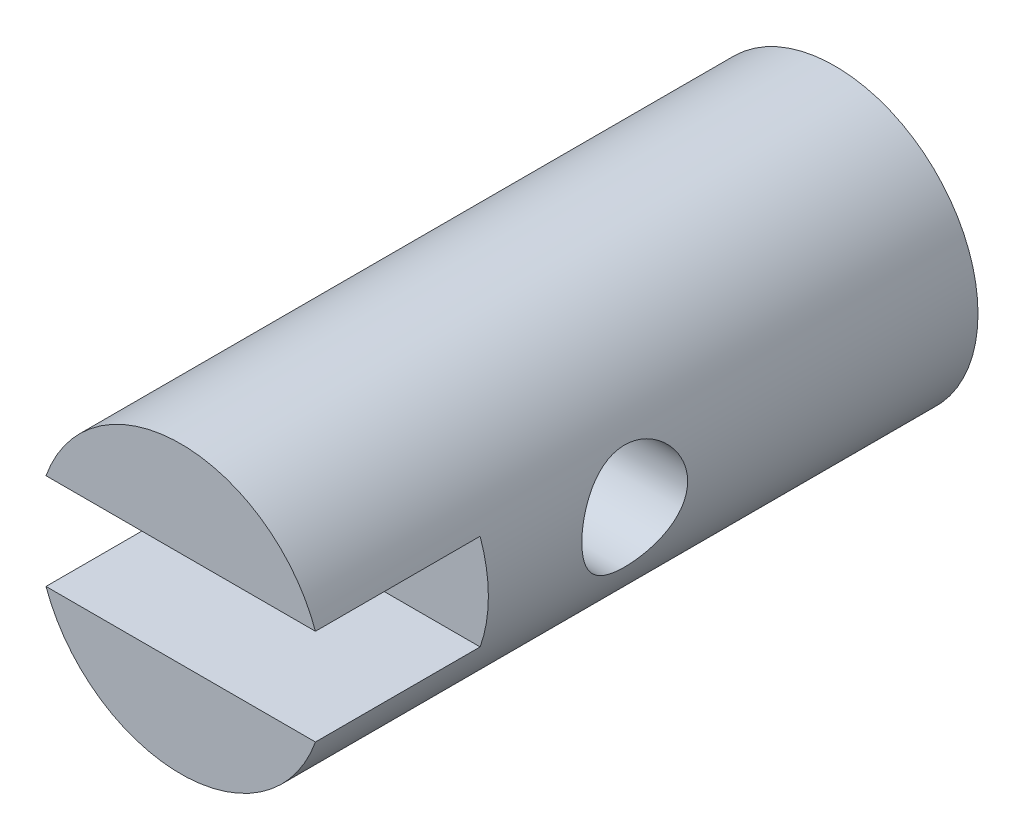
ISO-10303-21;
HEADER;
FILE_DESCRIPTION(('STEP AP214'),'2;1');
FILE_NAME('part.step','',(''),(''),'','','');
FILE_SCHEMA(('AUTOMOTIVE_DESIGN { 1 0 10303 214 1 1 1 1 }'));
ENDSEC;
DATA;
#1=APPLICATION_CONTEXT('core data for automotive mechanical design processes');
#2=APPLICATION_PROTOCOL_DEFINITION('international standard','automotive_design',2000,#1);
#3=PRODUCT_CONTEXT('',#1,'mechanical');
#4=PRODUCT('Part','Part','',(#3));
#5=PRODUCT_RELATED_PRODUCT_CATEGORY('part','',(#4));
#6=PRODUCT_DEFINITION_FORMATION('','',#4);
#7=PRODUCT_DEFINITION_CONTEXT('part definition',#1,'design');
#8=PRODUCT_DEFINITION('design','',#6,#7);
#9=PRODUCT_DEFINITION_SHAPE('','',#8);
#10=(LENGTH_UNIT() NAMED_UNIT(*) SI_UNIT(.MILLI.,.METRE.));
#11=(NAMED_UNIT(*) PLANE_ANGLE_UNIT() SI_UNIT($,.RADIAN.));
#12=(NAMED_UNIT(*) SI_UNIT($,.STERADIAN.) SOLID_ANGLE_UNIT());
#13=UNCERTAINTY_MEASURE_WITH_UNIT(LENGTH_MEASURE(1.E-05),#10,'distance_accuracy_value','');
#14=(GEOMETRIC_REPRESENTATION_CONTEXT(3) GLOBAL_UNCERTAINTY_ASSIGNED_CONTEXT((#13)) GLOBAL_UNIT_ASSIGNED_CONTEXT((#10,
#11,#12)) REPRESENTATION_CONTEXT('',''));
#15=CARTESIAN_POINT('',(0.,0.,0.));
#16=DIRECTION('',(0.,0.,1.));
#17=DIRECTION('',(1.,0.,0.));
#18=AXIS2_PLACEMENT_3D('',#15,#16,#17);
#19=CARTESIAN_POINT('',(0.,0.,41.783));
#20=DIRECTION('',(0.,0.,1.));
#21=DIRECTION('',(1.,0.,0.));
#22=AXIS2_PLACEMENT_3D('',#19,#20,#21);
#23=PLANE('',#22);
#24=DIRECTION('',(-1.,0.,0.));
#25=VECTOR('',#24,1.);
#26=CARTESIAN_POINT('',(0.,3.0607,41.783));
#27=LINE('',#26,#25);
#28=CARTESIAN_POINT('',(8.60306661603873,3.0607,41.783));
#29=VERTEX_POINT('',#28);
#30=CARTESIAN_POINT('',(-8.60306661603873,3.0607,41.783));
#31=VERTEX_POINT('',#30);
#32=EDGE_CURVE('E141',#29,#31,#27,.T.);
#33=ORIENTED_EDGE('',*,*,#32,.F.);
#34=CARTESIAN_POINT('',(0.,0.,41.783));
#35=DIRECTION('',(0.,0.,1.));
#36=DIRECTION('',(1.,0.,0.));
#37=AXIS2_PLACEMENT_3D('',#34,#35,#36);
#38=CIRCLE('',#37,9.1313);
#39=EDGE_CURVE('E101',#29,#31,#38,.T.);
#40=ORIENTED_EDGE('',*,*,#39,.T.);
#41=EDGE_LOOP('',(#33,#40));
#42=FACE_BOUND('',#41,.T.);
#43=ADVANCED_FACE('F37',(#42),#23,.T.);
#44=CARTESIAN_POINT('',(0.,0.,41.783));
#45=DIRECTION('',(0.,0.,-1.));
#46=DIRECTION('',(-1.,0.,0.));
#47=AXIS2_PLACEMENT_3D('',#44,#45,#46);
#48=CYLINDRICAL_SURFACE('',#47,9.1313);
#49=CARTESIAN_POINT('',(-9.1313,0.,18.542));
#50=CARTESIAN_POINT('',(-9.13130424236576,0.18312558663475,18.5419942797425));
#51=CARTESIAN_POINT('',(-9.12574289228378,0.366211481619289,18.5569371379998));
#52=CARTESIAN_POINT('',(-9.10411228095916,0.726921230363973,18.6160794294865));
#53=CARTESIAN_POINT('',(-9.08804422098185,0.904545706114898,18.660275518109));
#54=CARTESIAN_POINT('',(-9.04712765580481,1.24907907890347,18.7761537380394));
#55=CARTESIAN_POINT('',(-9.02229581538571,1.41600760791391,18.8477837242498));
#56=CARTESIAN_POINT('',(-8.96633258913036,1.73546933260688,19.0162349237924));
#57=CARTESIAN_POINT('',(-8.93519956303128,1.88799876486627,19.1130626982449));
#58=CARTESIAN_POINT('',(-8.86841189125605,2.18066313409265,19.3333613414608));
#59=CARTESIAN_POINT('',(-8.83263165490555,2.32012084201554,19.457693486222));
#60=CARTESIAN_POINT('',(-8.76120914955084,2.57674800751189,19.727642986959));
#61=CARTESIAN_POINT('',(-8.72556692416797,2.69391090503595,19.8732665855357));
#62=CARTESIAN_POINT('',(-8.65700502397469,2.9068720613982,20.1882159476218));
#63=CARTESIAN_POINT('',(-8.62423416920776,3.00172340425047,20.3582176198172));
#64=CARTESIAN_POINT('',(-8.56707402338661,3.16118835797449,20.7131645761069));
#65=CARTESIAN_POINT('',(-8.54268148727349,3.22581367939103,20.8981040401934));
#66=CARTESIAN_POINT('',(-8.50637996489903,3.32033514427632,21.2698908698107));
#67=CARTESIAN_POINT('',(-8.49400923438129,3.35152106870543,21.4563637436525));
#68=CARTESIAN_POINT('',(-8.48179880574804,3.38231143014571,21.8322746573615));
#69=CARTESIAN_POINT('',(-8.48195410833446,3.38192846669752,22.0217114840961));
#70=CARTESIAN_POINT('',(-8.49437923598532,3.35058006377392,22.3864787565674));
#71=CARTESIAN_POINT('',(-8.50594590324745,3.32138967867976,22.561990111417));
#72=CARTESIAN_POINT('',(-8.53872418929337,3.23618458243237,22.9054196528171));
#73=CARTESIAN_POINT('',(-8.55993722115195,3.18016594120275,23.0733367229338));
#74=CARTESIAN_POINT('',(-8.61005096735515,3.04189681854693,23.4004806662734));
#75=CARTESIAN_POINT('',(-8.63908731588773,2.95917786757003,23.5594878478826));
#76=CARTESIAN_POINT('',(-8.70152940729719,2.77018251617408,23.8618855628594));
#77=CARTESIAN_POINT('',(-8.7349366284049,2.66389813743245,24.0052707826699));
#78=CARTESIAN_POINT('',(-8.80501714659955,2.42261729957539,24.282199616423));
#79=CARTESIAN_POINT('',(-8.84176129639271,2.28619954490603,24.4144899307269));
#80=CARTESIAN_POINT('',(-8.91249680825451,1.99268791637571,24.6546826838072));
#81=CARTESIAN_POINT('',(-8.94648776908502,1.835591037553,24.7625815719692));
#82=CARTESIAN_POINT('',(-9.00853099545885,1.50205256414142,24.9522616677038));
#83=CARTESIAN_POINT('',(-9.03648867812123,1.32536067888519,25.0336358872206));
#84=CARTESIAN_POINT('',(-9.08261587112278,0.95950456109184,25.1650918669263));
#85=CARTESIAN_POINT('',(-9.10078960747312,0.770345753124363,25.2151871390273));
#86=CARTESIAN_POINT('',(-9.12456375240749,0.395481222478244,25.2802778867122));
#87=CARTESIAN_POINT('',(-9.13076835443531,0.210106699788359,25.2969617572526));
#88=CARTESIAN_POINT('',(-9.13176528718625,-0.160875008558489,25.2996588732448));
#89=CARTESIAN_POINT('',(-9.12656006825316,-0.346482135706311,25.2856787040265));
#90=CARTESIAN_POINT('',(-9.10572110272806,-0.705432758511584,25.2287352060644));
#91=CARTESIAN_POINT('',(-9.09048238271331,-0.878975627510878,25.1868690700582));
#92=CARTESIAN_POINT('',(-9.05150520099281,-1.21645876235535,25.0767774362907));
#93=CARTESIAN_POINT('',(-9.02776563330302,-1.38039777548117,25.008548508565));
#94=CARTESIAN_POINT('',(-8.97328125122921,-1.69935749278386,24.8455088824674));
#95=CARTESIAN_POINT('',(-8.94235282305693,-1.85398029521322,24.7499829782563));
#96=CARTESIAN_POINT('',(-8.87692353417264,-2.14551328424185,24.5358731169672));
#97=CARTESIAN_POINT('',(-8.84242138215846,-2.28241702789415,24.4172808115694));
#98=CARTESIAN_POINT('',(-8.77123335838577,-2.54270286392124,24.1525231455044));
#99=CARTESIAN_POINT('',(-8.73453414075953,-2.66488573201806,24.0051793543205));
#100=CARTESIAN_POINT('',(-8.66498683791872,-2.88301733849523,23.6913472618306));
#101=CARTESIAN_POINT('',(-8.63213905022621,-2.97896405090036,23.5248574834666));
#102=CARTESIAN_POINT('',(-8.57418031791271,-3.14191275796083,23.1762781382869));
#103=CARTESIAN_POINT('',(-8.54909452798161,-3.20882092225717,22.9941402464957));
#104=CARTESIAN_POINT('',(-8.51020717438485,-3.31059501147468,22.6200006874294));
#105=CARTESIAN_POINT('',(-8.49639888319723,-3.34548004114043,22.4280049735465));
#106=CARTESIAN_POINT('',(-8.48250799884392,-3.38053533676716,22.0525549168265));
#107=CARTESIAN_POINT('',(-8.48161971278364,-3.38274349684881,21.8693190132469));
#108=CARTESIAN_POINT('',(-8.49161305387043,-3.35757757930272,21.5052347118639));
#109=CARTESIAN_POINT('',(-8.50249362554279,-3.3302061544818,21.3243861014314));
#110=CARTESIAN_POINT('',(-8.53413647114219,-3.24822814997297,20.9755045154519));
#111=CARTESIAN_POINT('',(-8.55460404361962,-3.19443161678157,20.807252207278));
#112=CARTESIAN_POINT('',(-8.60295043221061,-3.06183589435547,20.4820582610627));
#113=CARTESIAN_POINT('',(-8.63083109726976,-2.98303046654621,20.325119457223));
#114=CARTESIAN_POINT('',(-8.69264543551137,-2.79795046569028,20.0182416323915));
#115=CARTESIAN_POINT('',(-8.72681655501067,-2.69047229300375,19.8690768905604));
#116=CARTESIAN_POINT('',(-8.79652321419613,-2.45298200184552,19.5902480257283));
#117=CARTESIAN_POINT('',(-8.83205917884408,-2.32296281993459,19.4605900392132));
#118=CARTESIAN_POINT('',(-8.90271538590163,-2.03597991199217,19.2175770919631));
#119=CARTESIAN_POINT('',(-8.93771752088103,-1.87796533595855,19.105423385075));
#120=CARTESIAN_POINT('',(-9.00140098037153,-1.54410803498153,18.9093131502441));
#121=CARTESIAN_POINT('',(-9.03008209782517,-1.36826472629803,18.8253575459389));
#122=CARTESIAN_POINT('',(-9.07861442308264,-0.997681136348998,18.6864345386666));
#123=CARTESIAN_POINT('',(-9.09815320020889,-0.80251585470141,18.6324823527506));
#124=CARTESIAN_POINT('',(-9.12449066614428,-0.404881910906379,18.5602765891756));
#125=CARTESIAN_POINT('',(-9.13129531072785,-0.202416708129099,18.5420063228504));
#126=CARTESIAN_POINT('',(-9.1313,0.,18.542));
#127=B_SPLINE_CURVE_WITH_KNOTS('',3,(#49,#50,#51,#52,#53,#54,#55,#56,#57,#58,#59,#60,#61,#62,
#63,#64,#65,#66,#67,#68,#69,#70,#71,#72,#73,#74,#75,#76,#77,#78,#79,#80,#81,#82,#83,#84,#85,#86,
#87,#88,#89,#90,#91,#92,#93,#94,#95,#96,#97,#98,#99,#100,#101,#102,#103,#104,#105,#106,#107,
#108,#109,#110,#111,#112,#113,#114,#115,#116,#117,#118,#119,#120,#121,#122,#123,#124,#125,#126),
.UNSPECIFIED.,.T.,.F.,(4,2,2,2,2,2,2,2,2,2,2,2,2,2,2,2,2,2,2,2,2,2,2,2,2,2,2,2,2,2,2,2,2,2,2,2,
2,2,4),(0.,0.548630353450944,1.09719799122627,1.64472807035954,2.19240086088808,
2.76056404126807,3.32889414097234,3.91817726215296,4.50723188635902,5.07264430375144,
5.63783105902183,6.17023730575057,6.70272156863975,7.24510866135437,7.78767966606741,
8.36566603178298,8.94373647979363,9.53029947682892,10.1166089141494,10.6724564818738,
11.2281846888996,11.7632458615058,12.2983766723736,12.8490668508877,13.3999567103672,
13.9819380143595,14.5639642466926,15.147857388645,15.7314019578215,16.2783886385903,
16.825326267637,17.3564556980138,17.8877177251582,18.4462835035059,19.0050246311608,
19.5928746960232,20.180744014219,20.7874529326882,21.3938780214266),.UNSPECIFIED.);
#128=CARTESIAN_POINT('',(-9.1313,0.,18.542));
#129=VERTEX_POINT('',#128);
#130=EDGE_CURVE('E111',#129,#129,#127,.T.);
#131=ORIENTED_EDGE('',*,*,#130,.T.);
#132=EDGE_LOOP('',(#131));
#133=FACE_BOUND('',#132,.T.);
#134=CARTESIAN_POINT('',(9.1313,0.,18.542));
#135=CARTESIAN_POINT('',(9.13130424236576,-0.18312558663475,18.5419942797425));
#136=CARTESIAN_POINT('',(9.12574289228378,-0.366211481619289,18.5569371379998));
#137=CARTESIAN_POINT('',(9.10411228095916,-0.726921230363973,18.6160794294865));
#138=CARTESIAN_POINT('',(9.08804422098185,-0.904545706114898,18.660275518109));
#139=CARTESIAN_POINT('',(9.04712765580481,-1.24907907890347,18.7761537380394));
#140=CARTESIAN_POINT('',(9.02229581538571,-1.41600760791391,18.8477837242498));
#141=CARTESIAN_POINT('',(8.96633258913036,-1.73546933260688,19.0162349237924));
#142=CARTESIAN_POINT('',(8.93519956303128,-1.88799876486627,19.1130626982449));
#143=CARTESIAN_POINT('',(8.86841189125605,-2.18066313409265,19.3333613414608));
#144=CARTESIAN_POINT('',(8.83263165490555,-2.32012084201554,19.457693486222));
#145=CARTESIAN_POINT('',(8.76120914955084,-2.57674800751189,19.727642986959));
#146=CARTESIAN_POINT('',(8.72556692416797,-2.69391090503595,19.8732665855357));
#147=CARTESIAN_POINT('',(8.65700502397469,-2.9068720613982,20.1882159476218));
#148=CARTESIAN_POINT('',(8.62423416920776,-3.00172340425047,20.3582176198172));
#149=CARTESIAN_POINT('',(8.56707402338661,-3.16118835797449,20.7131645761069));
#150=CARTESIAN_POINT('',(8.54268148727349,-3.22581367939103,20.8981040401934));
#151=CARTESIAN_POINT('',(8.50637996489903,-3.32033514427632,21.2698908698107));
#152=CARTESIAN_POINT('',(8.49400923438129,-3.35152106870543,21.4563637436525));
#153=CARTESIAN_POINT('',(8.48179880574804,-3.38231143014571,21.8322746573615));
#154=CARTESIAN_POINT('',(8.48195410833446,-3.38192846669752,22.0217114840961));
#155=CARTESIAN_POINT('',(8.49437923598532,-3.35058006377392,22.3864787565674));
#156=CARTESIAN_POINT('',(8.50594590324745,-3.32138967867976,22.561990111417));
#157=CARTESIAN_POINT('',(8.53872418929337,-3.23618458243237,22.9054196528171));
#158=CARTESIAN_POINT('',(8.55993722115195,-3.18016594120275,23.0733367229338));
#159=CARTESIAN_POINT('',(8.61005096735515,-3.04189681854693,23.4004806662734));
#160=CARTESIAN_POINT('',(8.63908731588773,-2.95917786757003,23.5594878478826));
#161=CARTESIAN_POINT('',(8.70152940729719,-2.77018251617408,23.8618855628594));
#162=CARTESIAN_POINT('',(8.7349366284049,-2.66389813743245,24.0052707826699));
#163=CARTESIAN_POINT('',(8.80501714659955,-2.42261729957539,24.282199616423));
#164=CARTESIAN_POINT('',(8.84176129639271,-2.28619954490603,24.4144899307269));
#165=CARTESIAN_POINT('',(8.91249680825451,-1.99268791637571,24.6546826838072));
#166=CARTESIAN_POINT('',(8.94648776908502,-1.835591037553,24.7625815719692));
#167=CARTESIAN_POINT('',(9.00853099545885,-1.50205256414142,24.9522616677038));
#168=CARTESIAN_POINT('',(9.03648867812123,-1.32536067888519,25.0336358872206));
#169=CARTESIAN_POINT('',(9.08261587112278,-0.95950456109184,25.1650918669263));
#170=CARTESIAN_POINT('',(9.10078960747312,-0.770345753124363,25.2151871390273));
#171=CARTESIAN_POINT('',(9.12456375240749,-0.395481222478244,25.2802778867122));
#172=CARTESIAN_POINT('',(9.13076835443531,-0.210106699788359,25.2969617572526));
#173=CARTESIAN_POINT('',(9.13176528718625,0.160875008558489,25.2996588732448));
#174=CARTESIAN_POINT('',(9.12656006825316,0.346482135706311,25.2856787040265));
#175=CARTESIAN_POINT('',(9.10572110272806,0.705432758511584,25.2287352060644));
#176=CARTESIAN_POINT('',(9.09048238271331,0.878975627510878,25.1868690700582));
#177=CARTESIAN_POINT('',(9.05150520099281,1.21645876235535,25.0767774362907));
#178=CARTESIAN_POINT('',(9.02776563330302,1.38039777548117,25.008548508565));
#179=CARTESIAN_POINT('',(8.97328125122921,1.69935749278386,24.8455088824674));
#180=CARTESIAN_POINT('',(8.94235282305693,1.85398029521322,24.7499829782563));
#181=CARTESIAN_POINT('',(8.87692353417264,2.14551328424185,24.5358731169672));
#182=CARTESIAN_POINT('',(8.84242138215846,2.28241702789415,24.4172808115694));
#183=CARTESIAN_POINT('',(8.77123335838577,2.54270286392124,24.1525231455044));
#184=CARTESIAN_POINT('',(8.73453414075953,2.66488573201806,24.0051793543205));
#185=CARTESIAN_POINT('',(8.66498683791872,2.88301733849523,23.6913472618306));
#186=CARTESIAN_POINT('',(8.63213905022621,2.97896405090036,23.5248574834666));
#187=CARTESIAN_POINT('',(8.57418031791271,3.14191275796083,23.1762781382869));
#188=CARTESIAN_POINT('',(8.54909452798161,3.20882092225717,22.9941402464957));
#189=CARTESIAN_POINT('',(8.51020717438485,3.31059501147468,22.6200006874294));
#190=CARTESIAN_POINT('',(8.49639888319723,3.34548004114043,22.4280049735465));
#191=CARTESIAN_POINT('',(8.48250799884392,3.38053533676716,22.0525549168265));
#192=CARTESIAN_POINT('',(8.48161971278364,3.38274349684881,21.8693190132469));
#193=CARTESIAN_POINT('',(8.49161305387043,3.35757757930272,21.5052347118639));
#194=CARTESIAN_POINT('',(8.50249362554279,3.3302061544818,21.3243861014314));
#195=CARTESIAN_POINT('',(8.53413647114219,3.24822814997297,20.9755045154519));
#196=CARTESIAN_POINT('',(8.55460404361962,3.19443161678157,20.807252207278));
#197=CARTESIAN_POINT('',(8.60295043221061,3.06183589435547,20.4820582610627));
#198=CARTESIAN_POINT('',(8.63083109726976,2.98303046654621,20.325119457223));
#199=CARTESIAN_POINT('',(8.69264543551137,2.79795046569028,20.0182416323915));
#200=CARTESIAN_POINT('',(8.72681655501067,2.69047229300375,19.8690768905604));
#201=CARTESIAN_POINT('',(8.79652321419613,2.45298200184552,19.5902480257283));
#202=CARTESIAN_POINT('',(8.83205917884408,2.32296281993459,19.4605900392132));
#203=CARTESIAN_POINT('',(8.90271538590163,2.03597991199217,19.2175770919631));
#204=CARTESIAN_POINT('',(8.93771752088103,1.87796533595855,19.105423385075));
#205=CARTESIAN_POINT('',(9.00140098037153,1.54410803498153,18.9093131502441));
#206=CARTESIAN_POINT('',(9.03008209782517,1.36826472629803,18.8253575459389));
#207=CARTESIAN_POINT('',(9.07861442308264,0.997681136348998,18.6864345386666));
#208=CARTESIAN_POINT('',(9.09815320020889,0.80251585470141,18.6324823527506));
#209=CARTESIAN_POINT('',(9.12449066614428,0.404881910906379,18.5602765891756));
#210=CARTESIAN_POINT('',(9.13129531072785,0.202416708129099,18.5420063228504));
#211=CARTESIAN_POINT('',(9.1313,0.,18.542));
#212=B_SPLINE_CURVE_WITH_KNOTS('',3,(#134,#135,#136,#137,#138,#139,#140,#141,#142,#143,#144,
#145,#146,#147,#148,#149,#150,#151,#152,#153,#154,#155,#156,#157,#158,#159,#160,#161,#162,#163,
#164,#165,#166,#167,#168,#169,#170,#171,#172,#173,#174,#175,#176,#177,#178,#179,#180,#181,#182,
#183,#184,#185,#186,#187,#188,#189,#190,#191,#192,#193,#194,#195,#196,#197,#198,#199,#200,#201,
#202,#203,#204,#205,#206,#207,#208,#209,#210,#211),.UNSPECIFIED.,.T.,.F.,(4,2,2,2,2,2,2,2,2,2,2,
2,2,2,2,2,2,2,2,2,2,2,2,2,2,2,2,2,2,2,2,2,2,2,2,2,2,2,4),(0.,0.548630353450944,1.09719799122627,
1.64472807035954,2.19240086088808,2.76056404126807,3.32889414097234,3.91817726215296,
4.50723188635902,5.07264430375144,5.63783105902183,6.17023730575057,6.70272156863975,
7.24510866135437,7.78767966606741,8.36566603178298,8.94373647979363,9.53029947682892,
10.1166089141494,10.6724564818738,11.2281846888996,11.7632458615058,12.2983766723736,
12.8490668508877,13.3999567103672,13.9819380143595,14.5639642466926,15.147857388645,
15.7314019578215,16.2783886385903,16.825326267637,17.3564556980138,17.8877177251582,
18.4462835035059,19.0050246311608,19.5928746960232,20.180744014219,20.7874529326882,
21.3938780214266),.UNSPECIFIED.);
#213=CARTESIAN_POINT('',(9.1313,0.,18.542));
#214=VERTEX_POINT('',#213);
#215=EDGE_CURVE('E104',#214,#214,#212,.T.);
#216=ORIENTED_EDGE('',*,*,#215,.T.);
#217=EDGE_LOOP('',(#216));
#218=FACE_BOUND('',#217,.T.);
#219=CARTESIAN_POINT('',(0.,0.,31.2674));
#220=DIRECTION('',(0.,0.,-1.));
#221=DIRECTION('',(-1.,0.,0.));
#222=AXIS2_PLACEMENT_3D('',#219,#220,#221);
#223=CIRCLE('',#222,9.1313);
#224=CARTESIAN_POINT('',(-8.60306661603873,-3.0607,31.2674));
#225=VERTEX_POINT('',#224);
#226=CARTESIAN_POINT('',(-8.60306661603873,3.0607,31.2674));
#227=VERTEX_POINT('',#226);
#228=EDGE_CURVE('E11',#225,#227,#223,.T.);
#229=ORIENTED_EDGE('',*,*,#228,.T.);
#230=DIRECTION('',(0.,0.,-1.));
#231=VECTOR('',#230,1.);
#232=CARTESIAN_POINT('',(-8.60306661603873,3.0607,41.783));
#233=LINE('',#232,#231);
#234=EDGE_CURVE('E91',#227,#31,#233,.F.);
#235=ORIENTED_EDGE('',*,*,#234,.T.);
#236=ORIENTED_EDGE('',*,*,#39,.F.);
#237=DIRECTION('',(0.,0.,-1.));
#238=VECTOR('',#237,1.);
#239=CARTESIAN_POINT('',(8.60306661603873,3.0607,41.783));
#240=LINE('',#239,#238);
#241=CARTESIAN_POINT('',(8.60306661603873,3.0607,31.2674));
#242=VERTEX_POINT('',#241);
#243=EDGE_CURVE('E93',#29,#242,#240,.T.);
#244=ORIENTED_EDGE('',*,*,#243,.T.);
#245=CARTESIAN_POINT('',(8.60306661603873,-3.0607,31.2674));
#246=VERTEX_POINT('',#245);
#247=EDGE_CURVE('E42',#242,#246,#223,.T.);
#248=ORIENTED_EDGE('',*,*,#247,.T.);
#249=DIRECTION('',(0.,0.,-1.));
#250=VECTOR('',#249,1.);
#251=CARTESIAN_POINT('',(8.60306661603873,-3.0607,41.783));
#252=LINE('',#251,#250);
#253=CARTESIAN_POINT('',(8.60306661603873,-3.0607,41.783));
#254=VERTEX_POINT('',#253);
#255=EDGE_CURVE('E85',#246,#254,#252,.F.);
#256=ORIENTED_EDGE('',*,*,#255,.T.);
#257=CARTESIAN_POINT('',(-8.60306661603873,-3.0607,41.783));
#258=VERTEX_POINT('',#257);
#259=EDGE_CURVE('E90',#258,#254,#38,.T.);
#260=ORIENTED_EDGE('',*,*,#259,.F.);
#261=DIRECTION('',(0.,0.,-1.));
#262=VECTOR('',#261,1.);
#263=CARTESIAN_POINT('',(-8.60306661603873,-3.0607,41.783));
#264=LINE('',#263,#262);
#265=EDGE_CURVE('E53',#258,#225,#264,.T.);
#266=ORIENTED_EDGE('',*,*,#265,.T.);
#267=EDGE_LOOP('',(#229,#235,#236,#244,#248,#256,#260,#266));
#268=FACE_BOUND('',#267,.T.);
#269=CARTESIAN_POINT('',(0.,0.,0.));
#270=DIRECTION('',(0.,0.,1.));
#271=DIRECTION('',(1.,0.,0.));
#272=AXIS2_PLACEMENT_3D('',#269,#270,#271);
#273=CIRCLE('',#272,9.1313);
#274=CARTESIAN_POINT('',(9.1313,0.,0.));
#275=VERTEX_POINT('',#274);
#276=EDGE_CURVE('E99',#275,#275,#273,.T.);
#277=ORIENTED_EDGE('',*,*,#276,.T.);
#278=EDGE_LOOP('',(#277));
#279=FACE_BOUND('',#278,.T.);
#280=ADVANCED_FACE('F39',(#133,#218,#268,#279),#48,.T.);
#281=DIRECTION('',(1.,0.,0.));
#282=VECTOR('',#281,1.);
#283=CARTESIAN_POINT('',(0.,-3.0607,41.783));
#284=LINE('',#283,#282);
#285=EDGE_CURVE('E144',#258,#254,#284,.T.);
#286=ORIENTED_EDGE('',*,*,#285,.F.);
#287=ORIENTED_EDGE('',*,*,#259,.T.);
#288=EDGE_LOOP('',(#286,#287));
#289=FACE_BOUND('',#288,.T.);
#290=ADVANCED_FACE('F124',(#289),#23,.T.);
#291=CARTESIAN_POINT('',(0.,0.,0.));
#292=DIRECTION('',(0.,0.,1.));
#293=DIRECTION('',(1.,0.,0.));
#294=AXIS2_PLACEMENT_3D('',#291,#292,#293);
#295=PLANE('',#294);
#296=ORIENTED_EDGE('',*,*,#276,.F.);
#297=EDGE_LOOP('',(#296));
#298=FACE_BOUND('',#297,.T.);
#299=ADVANCED_FACE('F121',(#298),#295,.F.);
#300=CARTESIAN_POINT('',(-9.1313,0.,21.9202));
#301=DIRECTION('',(1.,0.,0.));
#302=DIRECTION('',(0.,0.,-1.));
#303=AXIS2_PLACEMENT_3D('',#300,#301,#302);
#304=CYLINDRICAL_SURFACE('',#303,3.3782);
#305=ORIENTED_EDGE('',*,*,#215,.F.);
#306=EDGE_LOOP('',(#305));
#307=FACE_BOUND('',#306,.T.);
#308=ORIENTED_EDGE('',*,*,#130,.F.);
#309=EDGE_LOOP('',(#308));
#310=FACE_BOUND('',#309,.T.);
#311=ADVANCED_FACE('F116',(#307,#310),#304,.F.);
#312=CARTESIAN_POINT('',(-9.1313,3.0607,31.2674));
#313=DIRECTION('',(0.,0.,-1.));
#314=DIRECTION('',(-1.,0.,0.));
#315=AXIS2_PLACEMENT_3D('',#312,#313,#314);
#316=PLANE('',#315);
#317=DIRECTION('',(1.,0.,0.));
#318=VECTOR('',#317,1.);
#319=CARTESIAN_POINT('',(-9.1313,3.0607,31.2674));
#320=LINE('',#319,#318);
#321=EDGE_CURVE('E79',#227,#242,#320,.T.);
#322=ORIENTED_EDGE('',*,*,#321,.F.);
#323=ORIENTED_EDGE('',*,*,#228,.F.);
#324=DIRECTION('',(1.,0.,0.));
#325=VECTOR('',#324,1.);
#326=CARTESIAN_POINT('',(-9.1313,-3.0607,31.2674));
#327=LINE('',#326,#325);
#328=EDGE_CURVE('E78',#225,#246,#327,.T.);
#329=ORIENTED_EDGE('',*,*,#328,.T.);
#330=ORIENTED_EDGE('',*,*,#247,.F.);
#331=EDGE_LOOP('',(#322,#323,#329,#330));
#332=FACE_BOUND('',#331,.T.);
#333=ADVANCED_FACE('F77',(#332),#316,.F.);
#334=CARTESIAN_POINT('',(-9.1313,3.0607,41.783));
#335=DIRECTION('',(0.,1.,0.));
#336=DIRECTION('',(0.,0.,1.));
#337=AXIS2_PLACEMENT_3D('',#334,#335,#336);
#338=PLANE('',#337);
#339=ORIENTED_EDGE('',*,*,#32,.T.);
#340=ORIENTED_EDGE('',*,*,#234,.F.);
#341=ORIENTED_EDGE('',*,*,#321,.T.);
#342=ORIENTED_EDGE('',*,*,#243,.F.);
#343=EDGE_LOOP('',(#339,#340,#341,#342));
#344=FACE_BOUND('',#343,.T.);
#345=ADVANCED_FACE('F145',(#344),#338,.F.);
#346=CARTESIAN_POINT('',(-9.1313,-3.0607,31.2674));
#347=DIRECTION('',(0.,-1.,0.));
#348=DIRECTION('',(0.,0.,-1.));
#349=AXIS2_PLACEMENT_3D('',#346,#347,#348);
#350=PLANE('',#349);
#351=ORIENTED_EDGE('',*,*,#285,.T.);
#352=ORIENTED_EDGE('',*,*,#255,.F.);
#353=ORIENTED_EDGE('',*,*,#328,.F.);
#354=ORIENTED_EDGE('',*,*,#265,.F.);
#355=EDGE_LOOP('',(#351,#352,#353,#354));
#356=FACE_BOUND('',#355,.T.);
#357=ADVANCED_FACE('F83',(#356),#350,.F.);
#358=CLOSED_SHELL('',(#43,#280,#290,#299,#311,#333,#345,#357));
#359=MANIFOLD_SOLID_BREP('B2',#358);
#360=ADVANCED_BREP_SHAPE_REPRESENTATION('',(#18,#359),#14);
#361=SHAPE_DEFINITION_REPRESENTATION(#9,#360);
ENDSEC;
END-ISO-10303-21;
